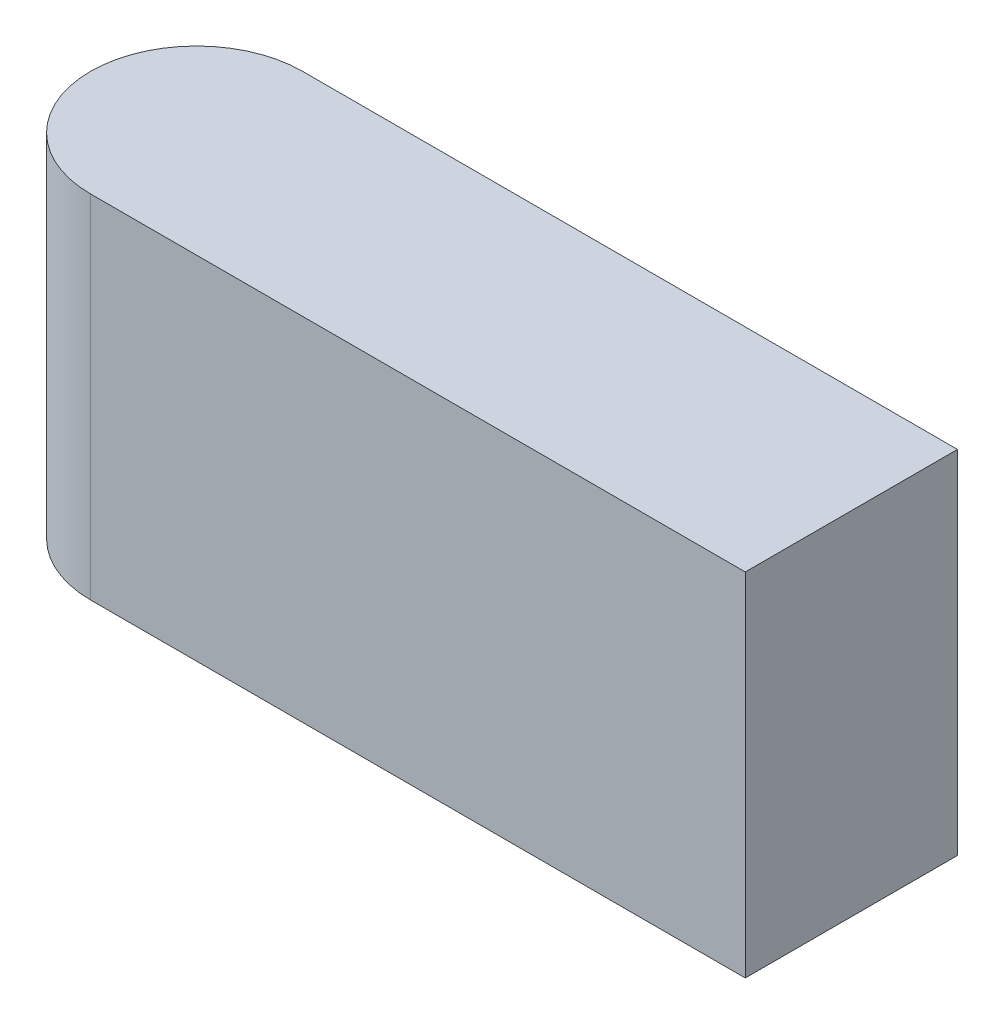
ISO-10303-21;
HEADER;
FILE_DESCRIPTION(('STEP AP214'),'2;1');
FILE_NAME('part.step','',(''),(''),'','','');
FILE_SCHEMA(('AUTOMOTIVE_DESIGN { 1 0 10303 214 1 1 1 1 }'));
ENDSEC;
DATA;
#1=APPLICATION_CONTEXT('core data for automotive mechanical design processes');
#2=APPLICATION_PROTOCOL_DEFINITION('international standard','automotive_design',2000,#1);
#3=PRODUCT_CONTEXT('',#1,'mechanical');
#4=PRODUCT('Part','Part','',(#3));
#5=PRODUCT_RELATED_PRODUCT_CATEGORY('part','',(#4));
#6=PRODUCT_DEFINITION_FORMATION('','',#4);
#7=PRODUCT_DEFINITION_CONTEXT('part definition',#1,'design');
#8=PRODUCT_DEFINITION('design','',#6,#7);
#9=PRODUCT_DEFINITION_SHAPE('','',#8);
#10=(LENGTH_UNIT() NAMED_UNIT(*) SI_UNIT(.MILLI.,.METRE.));
#11=(NAMED_UNIT(*) PLANE_ANGLE_UNIT() SI_UNIT($,.RADIAN.));
#12=(NAMED_UNIT(*) SI_UNIT($,.STERADIAN.) SOLID_ANGLE_UNIT());
#13=UNCERTAINTY_MEASURE_WITH_UNIT(LENGTH_MEASURE(1.E-05),#10,'distance_accuracy_value','');
#14=(GEOMETRIC_REPRESENTATION_CONTEXT(3) GLOBAL_UNCERTAINTY_ASSIGNED_CONTEXT((#13)) GLOBAL_UNIT_ASSIGNED_CONTEXT((#10,
#11,#12)) REPRESENTATION_CONTEXT('',''));
#15=CARTESIAN_POINT('',(0.,0.,0.));
#16=DIRECTION('',(0.,0.,1.));
#17=DIRECTION('',(1.,0.,0.));
#18=AXIS2_PLACEMENT_3D('',#15,#16,#17);
#19=CARTESIAN_POINT('',(0.,29.,-8.75));
#20=DIRECTION('',(0.,-1.,0.));
#21=DIRECTION('',(0.,0.,-1.));
#22=AXIS2_PLACEMENT_3D('',#19,#20,#21);
#23=CYLINDRICAL_SURFACE('',#22,8.75);
#24=CARTESIAN_POINT('',(0.,0.,-8.75));
#25=DIRECTION('',(0.,1.,0.));
#26=DIRECTION('',(0.,0.,-1.));
#27=AXIS2_PLACEMENT_3D('',#24,#25,#26);
#28=CIRCLE('',#27,8.75);
#29=CARTESIAN_POINT('',(0.,0.,-17.5));
#30=VERTEX_POINT('',#29);
#31=CARTESIAN_POINT('',(0.,0.,0.));
#32=VERTEX_POINT('',#31);
#33=EDGE_CURVE('E96',#30,#32,#28,.T.);
#34=ORIENTED_EDGE('',*,*,#33,.T.);
#35=DIRECTION('',(0.,-1.,0.));
#36=VECTOR('',#35,1.);
#37=CARTESIAN_POINT('',(0.,29.,0.));
#38=LINE('',#37,#36);
#39=CARTESIAN_POINT('',(0.,29.,0.));
#40=VERTEX_POINT('',#39);
#41=EDGE_CURVE('E11',#40,#32,#38,.T.);
#42=ORIENTED_EDGE('',*,*,#41,.F.);
#43=CARTESIAN_POINT('',(0.,29.,-8.75));
#44=DIRECTION('',(0.,1.,0.));
#45=DIRECTION('',(0.,0.,-1.));
#46=AXIS2_PLACEMENT_3D('',#43,#44,#45);
#47=CIRCLE('',#46,8.75);
#48=CARTESIAN_POINT('',(0.,29.,-17.5));
#49=VERTEX_POINT('',#48);
#50=EDGE_CURVE('E84',#49,#40,#47,.T.);
#51=ORIENTED_EDGE('',*,*,#50,.F.);
#52=DIRECTION('',(0.,-1.,0.));
#53=VECTOR('',#52,1.);
#54=CARTESIAN_POINT('',(0.,29.,-17.5));
#55=LINE('',#54,#53);
#56=EDGE_CURVE('E92',#49,#30,#55,.T.);
#57=ORIENTED_EDGE('',*,*,#56,.T.);
#58=EDGE_LOOP('',(#34,#42,#51,#57));
#59=FACE_BOUND('',#58,.T.);
#60=ADVANCED_FACE('F33',(#59),#23,.T.);
#61=CARTESIAN_POINT('',(0.,29.,0.));
#62=DIRECTION('',(0.,0.,-1.));
#63=DIRECTION('',(-1.,0.,0.));
#64=AXIS2_PLACEMENT_3D('',#61,#62,#63);
#65=PLANE('',#64);
#66=DIRECTION('',(1.,0.,0.));
#67=VECTOR('',#66,1.);
#68=CARTESIAN_POINT('',(0.,0.,0.));
#69=LINE('',#68,#67);
#70=CARTESIAN_POINT('',(54.,0.,0.));
#71=VERTEX_POINT('',#70);
#72=EDGE_CURVE('E88',#32,#71,#69,.T.);
#73=ORIENTED_EDGE('',*,*,#72,.T.);
#74=DIRECTION('',(0.,-1.,0.));
#75=VECTOR('',#74,1.);
#76=CARTESIAN_POINT('',(54.,29.,0.));
#77=LINE('',#76,#75);
#78=CARTESIAN_POINT('',(54.,29.,0.));
#79=VERTEX_POINT('',#78);
#80=EDGE_CURVE('E41',#79,#71,#77,.T.);
#81=ORIENTED_EDGE('',*,*,#80,.F.);
#82=DIRECTION('',(1.,0.,0.));
#83=VECTOR('',#82,1.);
#84=CARTESIAN_POINT('',(0.,29.,0.));
#85=LINE('',#84,#83);
#86=EDGE_CURVE('E79',#40,#79,#85,.T.);
#87=ORIENTED_EDGE('',*,*,#86,.F.);
#88=ORIENTED_EDGE('',*,*,#41,.T.);
#89=EDGE_LOOP('',(#73,#81,#87,#88));
#90=FACE_BOUND('',#89,.T.);
#91=ADVANCED_FACE('F87',(#90),#65,.F.);
#92=CARTESIAN_POINT('',(54.,29.,0.));
#93=DIRECTION('',(-1.,0.,0.));
#94=DIRECTION('',(0.,0.,1.));
#95=AXIS2_PLACEMENT_3D('',#92,#93,#94);
#96=PLANE('',#95);
#97=DIRECTION('',(0.,0.,-1.));
#98=VECTOR('',#97,1.);
#99=CARTESIAN_POINT('',(54.,0.,0.));
#100=LINE('',#99,#98);
#101=CARTESIAN_POINT('',(54.,0.,-17.5));
#102=VERTEX_POINT('',#101);
#103=EDGE_CURVE('E66',#71,#102,#100,.T.);
#104=ORIENTED_EDGE('',*,*,#103,.T.);
#105=DIRECTION('',(0.,-1.,0.));
#106=VECTOR('',#105,1.);
#107=CARTESIAN_POINT('',(54.,29.,-17.5));
#108=LINE('',#107,#106);
#109=CARTESIAN_POINT('',(54.,29.,-17.5));
#110=VERTEX_POINT('',#109);
#111=EDGE_CURVE('E89',#110,#102,#108,.T.);
#112=ORIENTED_EDGE('',*,*,#111,.F.);
#113=DIRECTION('',(0.,0.,-1.));
#114=VECTOR('',#113,1.);
#115=CARTESIAN_POINT('',(54.,29.,0.));
#116=LINE('',#115,#114);
#117=EDGE_CURVE('E82',#79,#110,#116,.T.);
#118=ORIENTED_EDGE('',*,*,#117,.F.);
#119=ORIENTED_EDGE('',*,*,#80,.T.);
#120=EDGE_LOOP('',(#104,#112,#118,#119));
#121=FACE_BOUND('',#120,.T.);
#122=ADVANCED_FACE('F90',(#121),#96,.F.);
#123=CARTESIAN_POINT('',(0.,29.,-17.5));
#124=DIRECTION('',(0.,0.,1.));
#125=DIRECTION('',(1.,0.,0.));
#126=AXIS2_PLACEMENT_3D('',#123,#124,#125);
#127=PLANE('',#126);
#128=DIRECTION('',(-1.,0.,0.));
#129=VECTOR('',#128,1.);
#130=CARTESIAN_POINT('',(0.,0.,-17.5));
#131=LINE('',#130,#129);
#132=EDGE_CURVE('E72',#102,#30,#131,.T.);
#133=ORIENTED_EDGE('',*,*,#132,.T.);
#134=ORIENTED_EDGE('',*,*,#56,.F.);
#135=DIRECTION('',(-1.,0.,0.));
#136=VECTOR('',#135,1.);
#137=CARTESIAN_POINT('',(0.,29.,-17.5));
#138=LINE('',#137,#136);
#139=EDGE_CURVE('E49',#110,#49,#138,.T.);
#140=ORIENTED_EDGE('',*,*,#139,.F.);
#141=ORIENTED_EDGE('',*,*,#111,.T.);
#142=EDGE_LOOP('',(#133,#134,#140,#141));
#143=FACE_BOUND('',#142,.T.);
#144=ADVANCED_FACE('F103',(#143),#127,.F.);
#145=CARTESIAN_POINT('',(0.,29.,-8.75));
#146=DIRECTION('',(0.,-1.,0.));
#147=DIRECTION('',(0.,0.,-1.));
#148=AXIS2_PLACEMENT_3D('',#145,#146,#147);
#149=PLANE('',#148);
#150=ORIENTED_EDGE('',*,*,#50,.T.);
#151=ORIENTED_EDGE('',*,*,#86,.T.);
#152=ORIENTED_EDGE('',*,*,#117,.T.);
#153=ORIENTED_EDGE('',*,*,#139,.T.);
#154=EDGE_LOOP('',(#150,#151,#152,#153));
#155=FACE_BOUND('',#154,.T.);
#156=ADVANCED_FACE('F80',(#155),#149,.F.);
#157=CARTESIAN_POINT('',(0.,0.,-8.75));
#158=DIRECTION('',(0.,-1.,0.));
#159=DIRECTION('',(0.,0.,-1.));
#160=AXIS2_PLACEMENT_3D('',#157,#158,#159);
#161=PLANE('',#160);
#162=ORIENTED_EDGE('',*,*,#33,.F.);
#163=ORIENTED_EDGE('',*,*,#132,.F.);
#164=ORIENTED_EDGE('',*,*,#103,.F.);
#165=ORIENTED_EDGE('',*,*,#72,.F.);
#166=EDGE_LOOP('',(#162,#163,#164,#165));
#167=FACE_BOUND('',#166,.T.);
#168=ADVANCED_FACE('F106',(#167),#161,.T.);
#169=CLOSED_SHELL('',(#60,#91,#122,#144,#156,#168));
#170=MANIFOLD_SOLID_BREP('B2',#169);
#171=ADVANCED_BREP_SHAPE_REPRESENTATION('',(#18,#170),#14);
#172=SHAPE_DEFINITION_REPRESENTATION(#9,#171);
ENDSEC;
END-ISO-10303-21;
